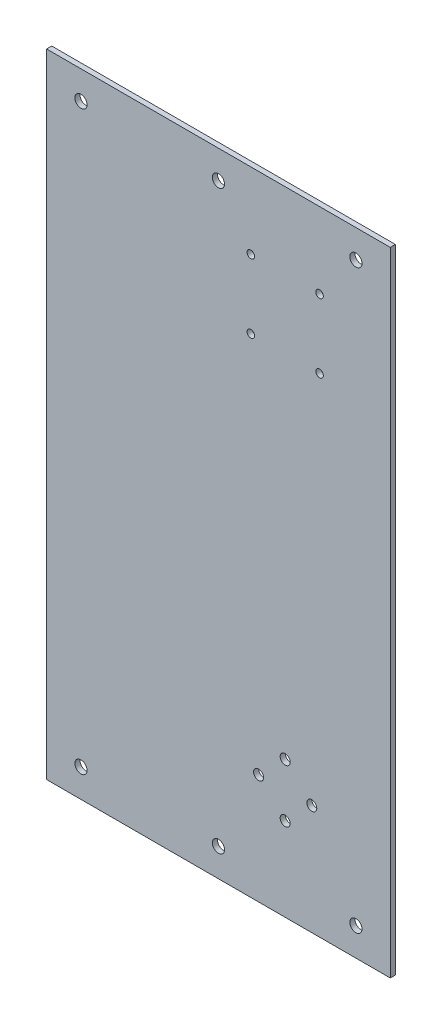
ISO-10303-21;
HEADER;
FILE_DESCRIPTION(('STEP AP214'),'2;1');
FILE_NAME('part.step','',(''),(''),'','','');
FILE_SCHEMA(('AUTOMOTIVE_DESIGN { 1 0 10303 214 1 1 1 1 }'));
ENDSEC;
DATA;
#1=APPLICATION_CONTEXT('core data for automotive mechanical design processes');
#2=APPLICATION_PROTOCOL_DEFINITION('international standard','automotive_design',2000,#1);
#3=PRODUCT_CONTEXT('',#1,'mechanical');
#4=PRODUCT('Part','Part','',(#3));
#5=PRODUCT_RELATED_PRODUCT_CATEGORY('part','',(#4));
#6=PRODUCT_DEFINITION_FORMATION('','',#4);
#7=PRODUCT_DEFINITION_CONTEXT('part definition',#1,'design');
#8=PRODUCT_DEFINITION('design','',#6,#7);
#9=PRODUCT_DEFINITION_SHAPE('','',#8);
#10=(LENGTH_UNIT() NAMED_UNIT(*) SI_UNIT(.MILLI.,.METRE.));
#11=(NAMED_UNIT(*) PLANE_ANGLE_UNIT() SI_UNIT($,.RADIAN.));
#12=(NAMED_UNIT(*) SI_UNIT($,.STERADIAN.) SOLID_ANGLE_UNIT());
#13=UNCERTAINTY_MEASURE_WITH_UNIT(LENGTH_MEASURE(1.E-05),#10,'distance_accuracy_value','');
#14=(GEOMETRIC_REPRESENTATION_CONTEXT(3) GLOBAL_UNCERTAINTY_ASSIGNED_CONTEXT((#13)) GLOBAL_UNIT_ASSIGNED_CONTEXT((#10,
#11,#12)) REPRESENTATION_CONTEXT('',''));
#15=CARTESIAN_POINT('',(0.,0.,0.));
#16=DIRECTION('',(0.,0.,1.));
#17=DIRECTION('',(1.,0.,0.));
#18=AXIS2_PLACEMENT_3D('',#15,#16,#17);
#19=CARTESIAN_POINT('',(77.5,142.695,2.305));
#20=DIRECTION('',(-1.,0.,0.));
#21=DIRECTION('',(0.,-1.,0.));
#22=AXIS2_PLACEMENT_3D('',#19,#20,#21);
#23=PLANE('',#22);
#24=DIRECTION('',(0.,1.,0.));
#25=VECTOR('',#24,1.);
#26=CARTESIAN_POINT('',(77.5,142.695,0.));
#27=LINE('',#26,#25);
#28=CARTESIAN_POINT('',(77.5,-142.695,0.));
#29=VERTEX_POINT('',#28);
#30=CARTESIAN_POINT('',(77.5,142.695,0.));
#31=VERTEX_POINT('',#30);
#32=EDGE_CURVE('E113',#29,#31,#27,.T.);
#33=ORIENTED_EDGE('',*,*,#32,.T.);
#34=DIRECTION('',(0.,0.,-1.));
#35=VECTOR('',#34,1.);
#36=CARTESIAN_POINT('',(77.5,142.695,2.305));
#37=LINE('',#36,#35);
#38=CARTESIAN_POINT('',(77.5,142.695,2.305));
#39=VERTEX_POINT('',#38);
#40=EDGE_CURVE('E11',#39,#31,#37,.T.);
#41=ORIENTED_EDGE('',*,*,#40,.F.);
#42=DIRECTION('',(0.,1.,0.));
#43=VECTOR('',#42,1.);
#44=CARTESIAN_POINT('',(77.5,142.695,2.305));
#45=LINE('',#44,#43);
#46=CARTESIAN_POINT('',(77.5,-142.695,2.305));
#47=VERTEX_POINT('',#46);
#48=EDGE_CURVE('E95',#47,#39,#45,.T.);
#49=ORIENTED_EDGE('',*,*,#48,.F.);
#50=DIRECTION('',(0.,0.,-1.));
#51=VECTOR('',#50,1.);
#52=CARTESIAN_POINT('',(77.5,-142.695,2.305));
#53=LINE('',#52,#51);
#54=EDGE_CURVE('E109',#47,#29,#53,.T.);
#55=ORIENTED_EDGE('',*,*,#54,.T.);
#56=EDGE_LOOP('',(#33,#41,#49,#55));
#57=FACE_BOUND('',#56,.T.);
#58=ADVANCED_FACE('F43',(#57),#23,.F.);
#59=CARTESIAN_POINT('',(-77.5,142.695,2.305));
#60=DIRECTION('',(0.,-1.,0.));
#61=DIRECTION('',(0.,0.,-1.));
#62=AXIS2_PLACEMENT_3D('',#59,#60,#61);
#63=PLANE('',#62);
#64=DIRECTION('',(-1.,0.,0.));
#65=VECTOR('',#64,1.);
#66=CARTESIAN_POINT('',(-77.5,142.695,0.));
#67=LINE('',#66,#65);
#68=CARTESIAN_POINT('',(-77.5,142.695,0.));
#69=VERTEX_POINT('',#68);
#70=EDGE_CURVE('E100',#31,#69,#67,.T.);
#71=ORIENTED_EDGE('',*,*,#70,.T.);
#72=DIRECTION('',(0.,0.,-1.));
#73=VECTOR('',#72,1.);
#74=CARTESIAN_POINT('',(-77.5,142.695,2.305));
#75=LINE('',#74,#73);
#76=CARTESIAN_POINT('',(-77.5,142.695,2.305));
#77=VERTEX_POINT('',#76);
#78=EDGE_CURVE('E52',#77,#69,#75,.T.);
#79=ORIENTED_EDGE('',*,*,#78,.F.);
#80=DIRECTION('',(-1.,0.,0.));
#81=VECTOR('',#80,1.);
#82=CARTESIAN_POINT('',(-77.5,142.695,2.305));
#83=LINE('',#82,#81);
#84=EDGE_CURVE('E90',#39,#77,#83,.T.);
#85=ORIENTED_EDGE('',*,*,#84,.F.);
#86=ORIENTED_EDGE('',*,*,#40,.T.);
#87=EDGE_LOOP('',(#71,#79,#85,#86));
#88=FACE_BOUND('',#87,.T.);
#89=ADVANCED_FACE('F99',(#88),#63,.F.);
#90=CARTESIAN_POINT('',(-77.5,142.695,2.305));
#91=DIRECTION('',(1.,0.,0.));
#92=DIRECTION('',(0.,1.,0.));
#93=AXIS2_PLACEMENT_3D('',#90,#91,#92);
#94=PLANE('',#93);
#95=DIRECTION('',(0.,-1.,0.));
#96=VECTOR('',#95,1.);
#97=CARTESIAN_POINT('',(-77.5,142.695,0.));
#98=LINE('',#97,#96);
#99=CARTESIAN_POINT('',(-77.5,-142.695,0.));
#100=VERTEX_POINT('',#99);
#101=EDGE_CURVE('E77',#69,#100,#98,.T.);
#102=ORIENTED_EDGE('',*,*,#101,.T.);
#103=DIRECTION('',(0.,0.,-1.));
#104=VECTOR('',#103,1.);
#105=CARTESIAN_POINT('',(-77.5,-142.695,2.305));
#106=LINE('',#105,#104);
#107=CARTESIAN_POINT('',(-77.5,-142.695,2.305));
#108=VERTEX_POINT('',#107);
#109=EDGE_CURVE('E102',#108,#100,#106,.T.);
#110=ORIENTED_EDGE('',*,*,#109,.F.);
#111=DIRECTION('',(0.,-1.,0.));
#112=VECTOR('',#111,1.);
#113=CARTESIAN_POINT('',(-77.5,142.695,2.305));
#114=LINE('',#113,#112);
#115=EDGE_CURVE('E93',#77,#108,#114,.T.);
#116=ORIENTED_EDGE('',*,*,#115,.F.);
#117=ORIENTED_EDGE('',*,*,#78,.T.);
#118=EDGE_LOOP('',(#102,#110,#116,#117));
#119=FACE_BOUND('',#118,.T.);
#120=ADVANCED_FACE('F103',(#119),#94,.F.);
#121=CARTESIAN_POINT('',(-77.5,-142.695,2.305));
#122=DIRECTION('',(0.,1.,0.));
#123=DIRECTION('',(0.,0.,1.));
#124=AXIS2_PLACEMENT_3D('',#121,#122,#123);
#125=PLANE('',#124);
#126=DIRECTION('',(1.,0.,0.));
#127=VECTOR('',#126,1.);
#128=CARTESIAN_POINT('',(-77.5,-142.695,0.));
#129=LINE('',#128,#127);
#130=EDGE_CURVE('E83',#100,#29,#129,.T.);
#131=ORIENTED_EDGE('',*,*,#130,.T.);
#132=ORIENTED_EDGE('',*,*,#54,.F.);
#133=DIRECTION('',(1.,0.,0.));
#134=VECTOR('',#133,1.);
#135=CARTESIAN_POINT('',(-77.5,-142.695,2.305));
#136=LINE('',#135,#134);
#137=EDGE_CURVE('E60',#108,#47,#136,.T.);
#138=ORIENTED_EDGE('',*,*,#137,.F.);
#139=ORIENTED_EDGE('',*,*,#109,.T.);
#140=EDGE_LOOP('',(#131,#132,#138,#139));
#141=FACE_BOUND('',#140,.T.);
#142=ADVANCED_FACE('F129',(#141),#125,.F.);
#143=CARTESIAN_POINT('',(0.,0.,2.305));
#144=DIRECTION('',(0.,0.,1.));
#145=DIRECTION('',(1.,0.,0.));
#146=AXIS2_PLACEMENT_3D('',#143,#144,#145);
#147=PLANE('',#146);
#148=CARTESIAN_POINT('',(62.,129.995,2.305));
#149=DIRECTION('',(0.,0.,1.));
#150=DIRECTION('',(1.,0.,0.));
#151=AXIS2_PLACEMENT_3D('',#148,#149,#150);
#152=CIRCLE('',#151,2.74999999999999);
#153=CARTESIAN_POINT('',(64.75,129.995,2.305));
#154=VERTEX_POINT('',#153);
#155=EDGE_CURVE('E245',#154,#154,#152,.T.);
#156=ORIENTED_EDGE('',*,*,#155,.F.);
#157=EDGE_LOOP('',(#156));
#158=FACE_BOUND('',#157,.T.);
#159=CARTESIAN_POINT('',(45.6,108.5,2.305));
#160=DIRECTION('',(0.,0.,1.));
#161=DIRECTION('',(1.,0.,0.));
#162=AXIS2_PLACEMENT_3D('',#159,#160,#161);
#163=CIRCLE('',#162,1.7);
#164=CARTESIAN_POINT('',(47.3,108.5,2.305));
#165=VERTEX_POINT('',#164);
#166=EDGE_CURVE('E202',#165,#165,#163,.T.);
#167=ORIENTED_EDGE('',*,*,#166,.F.);
#168=EDGE_LOOP('',(#167));
#169=FACE_BOUND('',#168,.T.);
#170=CARTESIAN_POINT('',(18.1,-92.9999999999999,2.305));
#171=DIRECTION('',(0.,0.,1.));
#172=DIRECTION('',(1.,0.,0.));
#173=AXIS2_PLACEMENT_3D('',#170,#171,#172);
#174=CIRCLE('',#173,2.25);
#175=CARTESIAN_POINT('',(20.35,-92.9999999999999,2.305));
#176=VERTEX_POINT('',#175);
#177=EDGE_CURVE('E211',#176,#176,#174,.T.);
#178=ORIENTED_EDGE('',*,*,#177,.F.);
#179=EDGE_LOOP('',(#178));
#180=FACE_BOUND('',#179,.T.);
#181=CARTESIAN_POINT('',(30.1,-105.,2.305));
#182=DIRECTION('',(0.,0.,1.));
#183=DIRECTION('',(1.,0.,0.));
#184=AXIS2_PLACEMENT_3D('',#181,#182,#183);
#185=CIRCLE('',#184,2.25);
#186=CARTESIAN_POINT('',(32.35,-105.,2.305));
#187=VERTEX_POINT('',#186);
#188=EDGE_CURVE('E186',#187,#187,#185,.T.);
#189=ORIENTED_EDGE('',*,*,#188,.F.);
#190=EDGE_LOOP('',(#189));
#191=FACE_BOUND('',#190,.T.);
#192=CARTESIAN_POINT('',(42.1,-92.9999999999999,2.305));
#193=DIRECTION('',(0.,0.,1.));
#194=DIRECTION('',(1.,0.,0.));
#195=AXIS2_PLACEMENT_3D('',#192,#193,#194);
#196=CIRCLE('',#195,2.25);
#197=CARTESIAN_POINT('',(44.35,-92.9999999999999,2.305));
#198=VERTEX_POINT('',#197);
#199=EDGE_CURVE('E195',#198,#198,#196,.T.);
#200=ORIENTED_EDGE('',*,*,#199,.F.);
#201=EDGE_LOOP('',(#200));
#202=FACE_BOUND('',#201,.T.);
#203=CARTESIAN_POINT('',(14.6,77.5,2.305));
#204=DIRECTION('',(0.,0.,1.));
#205=DIRECTION('',(1.,0.,0.));
#206=AXIS2_PLACEMENT_3D('',#203,#204,#205);
#207=CIRCLE('',#206,1.7);
#208=CARTESIAN_POINT('',(16.3,77.5,2.305));
#209=VERTEX_POINT('',#208);
#210=EDGE_CURVE('E235',#209,#209,#207,.T.);
#211=ORIENTED_EDGE('',*,*,#210,.F.);
#212=EDGE_LOOP('',(#211));
#213=FACE_BOUND('',#212,.T.);
#214=CARTESIAN_POINT('',(45.6,77.5,2.305));
#215=DIRECTION('',(0.,0.,1.));
#216=DIRECTION('',(1.,0.,0.));
#217=AXIS2_PLACEMENT_3D('',#214,#215,#216);
#218=CIRCLE('',#217,1.7);
#219=CARTESIAN_POINT('',(47.3,77.5,2.305));
#220=VERTEX_POINT('',#219);
#221=EDGE_CURVE('E227',#220,#220,#218,.T.);
#222=ORIENTED_EDGE('',*,*,#221,.F.);
#223=EDGE_LOOP('',(#222));
#224=FACE_BOUND('',#223,.T.);
#225=CARTESIAN_POINT('',(14.6,108.5,2.305));
#226=DIRECTION('',(0.,0.,1.));
#227=DIRECTION('',(1.,0.,0.));
#228=AXIS2_PLACEMENT_3D('',#225,#226,#227);
#229=CIRCLE('',#228,1.7);
#230=CARTESIAN_POINT('',(16.3,108.5,2.305));
#231=VERTEX_POINT('',#230);
#232=EDGE_CURVE('E218',#231,#231,#229,.T.);
#233=ORIENTED_EDGE('',*,*,#232,.F.);
#234=EDGE_LOOP('',(#233));
#235=FACE_BOUND('',#234,.T.);
#236=CARTESIAN_POINT('',(30.1,-80.9999999999999,2.305));
#237=DIRECTION('',(0.,0.,1.));
#238=DIRECTION('',(1.,0.,0.));
#239=AXIS2_PLACEMENT_3D('',#236,#237,#238);
#240=CIRCLE('',#239,2.25);
#241=CARTESIAN_POINT('',(32.35,-80.9999999999999,2.305));
#242=VERTEX_POINT('',#241);
#243=EDGE_CURVE('E178',#242,#242,#240,.T.);
#244=ORIENTED_EDGE('',*,*,#243,.F.);
#245=EDGE_LOOP('',(#244));
#246=FACE_BOUND('',#245,.T.);
#247=CARTESIAN_POINT('',(-62.,129.995,2.305));
#248=DIRECTION('',(0.,0.,1.));
#249=DIRECTION('',(1.,0.,0.));
#250=AXIS2_PLACEMENT_3D('',#247,#248,#249);
#251=CIRCLE('',#250,2.74999999999999);
#252=CARTESIAN_POINT('',(-59.25,129.995,2.305));
#253=VERTEX_POINT('',#252);
#254=EDGE_CURVE('E173',#253,#253,#251,.T.);
#255=ORIENTED_EDGE('',*,*,#254,.F.);
#256=EDGE_LOOP('',(#255));
#257=FACE_BOUND('',#256,.T.);
#258=CARTESIAN_POINT('',(0.,129.995,2.305));
#259=DIRECTION('',(0.,0.,1.));
#260=DIRECTION('',(1.,0.,0.));
#261=AXIS2_PLACEMENT_3D('',#258,#259,#260);
#262=CIRCLE('',#261,2.74999999999999);
#263=CARTESIAN_POINT('',(2.74999999999999,129.995,2.305));
#264=VERTEX_POINT('',#263);
#265=EDGE_CURVE('E165',#264,#264,#262,.T.);
#266=ORIENTED_EDGE('',*,*,#265,.F.);
#267=EDGE_LOOP('',(#266));
#268=FACE_BOUND('',#267,.T.);
#269=CARTESIAN_POINT('',(-62.,-129.995,2.305));
#270=DIRECTION('',(0.,0.,1.));
#271=DIRECTION('',(1.,0.,0.));
#272=AXIS2_PLACEMENT_3D('',#269,#270,#271);
#273=CIRCLE('',#272,2.74999999999999);
#274=CARTESIAN_POINT('',(-59.25,-129.995,2.305));
#275=VERTEX_POINT('',#274);
#276=EDGE_CURVE('E157',#275,#275,#273,.T.);
#277=ORIENTED_EDGE('',*,*,#276,.F.);
#278=EDGE_LOOP('',(#277));
#279=FACE_BOUND('',#278,.T.);
#280=CARTESIAN_POINT('',(0.,-129.995,2.305));
#281=DIRECTION('',(0.,0.,1.));
#282=DIRECTION('',(1.,0.,0.));
#283=AXIS2_PLACEMENT_3D('',#280,#281,#282);
#284=CIRCLE('',#283,2.74999999999999);
#285=CARTESIAN_POINT('',(2.74999999999999,-129.995,2.305));
#286=VERTEX_POINT('',#285);
#287=EDGE_CURVE('E149',#286,#286,#284,.T.);
#288=ORIENTED_EDGE('',*,*,#287,.F.);
#289=EDGE_LOOP('',(#288));
#290=FACE_BOUND('',#289,.T.);
#291=CARTESIAN_POINT('',(62.,-129.995,2.305));
#292=DIRECTION('',(0.,0.,1.));
#293=DIRECTION('',(1.,0.,0.));
#294=AXIS2_PLACEMENT_3D('',#291,#292,#293);
#295=CIRCLE('',#294,2.74999999999999);
#296=CARTESIAN_POINT('',(64.75,-129.995,2.305));
#297=VERTEX_POINT('',#296);
#298=EDGE_CURVE('E141',#297,#297,#295,.T.);
#299=ORIENTED_EDGE('',*,*,#298,.F.);
#300=EDGE_LOOP('',(#299));
#301=FACE_BOUND('',#300,.T.);
#302=ORIENTED_EDGE('',*,*,#48,.T.);
#303=ORIENTED_EDGE('',*,*,#84,.T.);
#304=ORIENTED_EDGE('',*,*,#115,.T.);
#305=ORIENTED_EDGE('',*,*,#137,.T.);
#306=EDGE_LOOP('',(#302,#303,#304,#305));
#307=FACE_BOUND('',#306,.T.);
#308=ADVANCED_FACE('F91',(#158,#169,#180,#191,#202,#213,#224,#235,#246,#257,#268,#279,#290,#301,
#307),#147,.T.);
#309=CARTESIAN_POINT('',(0.,0.,0.));
#310=DIRECTION('',(0.,0.,1.));
#311=DIRECTION('',(1.,0.,0.));
#312=AXIS2_PLACEMENT_3D('',#309,#310,#311);
#313=PLANE('',#312);
#314=CARTESIAN_POINT('',(62.,129.995,0.));
#315=DIRECTION('',(0.,0.,1.));
#316=DIRECTION('',(1.,0.,0.));
#317=AXIS2_PLACEMENT_3D('',#314,#315,#316);
#318=CIRCLE('',#317,2.75);
#319=CARTESIAN_POINT('',(64.75,129.995,0.));
#320=VERTEX_POINT('',#319);
#321=EDGE_CURVE('E223',#320,#320,#318,.T.);
#322=ORIENTED_EDGE('',*,*,#321,.T.);
#323=EDGE_LOOP('',(#322));
#324=FACE_BOUND('',#323,.T.);
#325=CARTESIAN_POINT('',(45.6,108.5,0.));
#326=DIRECTION('',(0.,0.,1.));
#327=DIRECTION('',(1.,0.,0.));
#328=AXIS2_PLACEMENT_3D('',#325,#326,#327);
#329=CIRCLE('',#328,1.7);
#330=CARTESIAN_POINT('',(47.3,108.5,0.));
#331=VERTEX_POINT('',#330);
#332=EDGE_CURVE('E206',#331,#331,#329,.T.);
#333=ORIENTED_EDGE('',*,*,#332,.T.);
#334=EDGE_LOOP('',(#333));
#335=FACE_BOUND('',#334,.T.);
#336=CARTESIAN_POINT('',(18.1,-92.9999999999999,0.));
#337=DIRECTION('',(0.,0.,1.));
#338=DIRECTION('',(1.,0.,0.));
#339=AXIS2_PLACEMENT_3D('',#336,#337,#338);
#340=CIRCLE('',#339,2.25);
#341=CARTESIAN_POINT('',(20.35,-92.9999999999999,0.));
#342=VERTEX_POINT('',#341);
#343=EDGE_CURVE('E191',#342,#342,#340,.T.);
#344=ORIENTED_EDGE('',*,*,#343,.T.);
#345=EDGE_LOOP('',(#344));
#346=FACE_BOUND('',#345,.T.);
#347=CARTESIAN_POINT('',(30.1,-105.,0.));
#348=DIRECTION('',(0.,0.,1.));
#349=DIRECTION('',(1.,0.,0.));
#350=AXIS2_PLACEMENT_3D('',#347,#348,#349);
#351=CIRCLE('',#350,2.25);
#352=CARTESIAN_POINT('',(32.35,-105.,0.));
#353=VERTEX_POINT('',#352);
#354=EDGE_CURVE('E190',#353,#353,#351,.T.);
#355=ORIENTED_EDGE('',*,*,#354,.T.);
#356=EDGE_LOOP('',(#355));
#357=FACE_BOUND('',#356,.T.);
#358=CARTESIAN_POINT('',(42.1,-92.9999999999999,0.));
#359=DIRECTION('',(0.,0.,1.));
#360=DIRECTION('',(1.,0.,0.));
#361=AXIS2_PLACEMENT_3D('',#358,#359,#360);
#362=CIRCLE('',#361,2.25);
#363=CARTESIAN_POINT('',(44.35,-92.9999999999999,0.));
#364=VERTEX_POINT('',#363);
#365=EDGE_CURVE('E182',#364,#364,#362,.T.);
#366=ORIENTED_EDGE('',*,*,#365,.T.);
#367=EDGE_LOOP('',(#366));
#368=FACE_BOUND('',#367,.T.);
#369=CARTESIAN_POINT('',(14.6,77.5,0.));
#370=DIRECTION('',(0.,0.,1.));
#371=DIRECTION('',(1.,0.,0.));
#372=AXIS2_PLACEMENT_3D('',#369,#370,#371);
#373=CIRCLE('',#372,1.7);
#374=CARTESIAN_POINT('',(16.3,77.5,0.));
#375=VERTEX_POINT('',#374);
#376=EDGE_CURVE('E207',#375,#375,#373,.T.);
#377=ORIENTED_EDGE('',*,*,#376,.T.);
#378=EDGE_LOOP('',(#377));
#379=FACE_BOUND('',#378,.T.);
#380=CARTESIAN_POINT('',(45.6,77.5,0.));
#381=DIRECTION('',(0.,0.,1.));
#382=DIRECTION('',(1.,0.,0.));
#383=AXIS2_PLACEMENT_3D('',#380,#381,#382);
#384=CIRCLE('',#383,1.7);
#385=CARTESIAN_POINT('',(47.3,77.5,0.));
#386=VERTEX_POINT('',#385);
#387=EDGE_CURVE('E231',#386,#386,#384,.T.);
#388=ORIENTED_EDGE('',*,*,#387,.T.);
#389=EDGE_LOOP('',(#388));
#390=FACE_BOUND('',#389,.T.);
#391=CARTESIAN_POINT('',(14.6,108.5,0.));
#392=DIRECTION('',(0.,0.,1.));
#393=DIRECTION('',(1.,0.,0.));
#394=AXIS2_PLACEMENT_3D('',#391,#392,#393);
#395=CIRCLE('',#394,1.7);
#396=CARTESIAN_POINT('',(16.3,108.5,0.));
#397=VERTEX_POINT('',#396);
#398=EDGE_CURVE('E222',#397,#397,#395,.T.);
#399=ORIENTED_EDGE('',*,*,#398,.T.);
#400=EDGE_LOOP('',(#399));
#401=FACE_BOUND('',#400,.T.);
#402=CARTESIAN_POINT('',(30.1,-80.9999999999999,0.));
#403=DIRECTION('',(0.,0.,1.));
#404=DIRECTION('',(1.,0.,0.));
#405=AXIS2_PLACEMENT_3D('',#402,#403,#404);
#406=CIRCLE('',#405,2.25);
#407=CARTESIAN_POINT('',(32.35,-80.9999999999999,0.));
#408=VERTEX_POINT('',#407);
#409=EDGE_CURVE('E177',#408,#408,#406,.T.);
#410=ORIENTED_EDGE('',*,*,#409,.T.);
#411=EDGE_LOOP('',(#410));
#412=FACE_BOUND('',#411,.T.);
#413=CARTESIAN_POINT('',(-62.,129.995,0.));
#414=DIRECTION('',(0.,0.,1.));
#415=DIRECTION('',(1.,0.,0.));
#416=AXIS2_PLACEMENT_3D('',#413,#414,#415);
#417=CIRCLE('',#416,2.75);
#418=CARTESIAN_POINT('',(-59.25,129.995,0.));
#419=VERTEX_POINT('',#418);
#420=EDGE_CURVE('E169',#419,#419,#417,.T.);
#421=ORIENTED_EDGE('',*,*,#420,.T.);
#422=EDGE_LOOP('',(#421));
#423=FACE_BOUND('',#422,.T.);
#424=CARTESIAN_POINT('',(0.,129.995,0.));
#425=DIRECTION('',(0.,0.,1.));
#426=DIRECTION('',(1.,0.,0.));
#427=AXIS2_PLACEMENT_3D('',#424,#425,#426);
#428=CIRCLE('',#427,2.75);
#429=CARTESIAN_POINT('',(2.75,129.995,0.));
#430=VERTEX_POINT('',#429);
#431=EDGE_CURVE('E161',#430,#430,#428,.T.);
#432=ORIENTED_EDGE('',*,*,#431,.T.);
#433=EDGE_LOOP('',(#432));
#434=FACE_BOUND('',#433,.T.);
#435=CARTESIAN_POINT('',(-62.,-129.995,0.));
#436=DIRECTION('',(0.,0.,1.));
#437=DIRECTION('',(1.,0.,0.));
#438=AXIS2_PLACEMENT_3D('',#435,#436,#437);
#439=CIRCLE('',#438,2.75);
#440=CARTESIAN_POINT('',(-59.25,-129.995,0.));
#441=VERTEX_POINT('',#440);
#442=EDGE_CURVE('E153',#441,#441,#439,.T.);
#443=ORIENTED_EDGE('',*,*,#442,.T.);
#444=EDGE_LOOP('',(#443));
#445=FACE_BOUND('',#444,.T.);
#446=CARTESIAN_POINT('',(0.,-129.995,0.));
#447=DIRECTION('',(0.,0.,1.));
#448=DIRECTION('',(1.,0.,0.));
#449=AXIS2_PLACEMENT_3D('',#446,#447,#448);
#450=CIRCLE('',#449,2.75);
#451=CARTESIAN_POINT('',(2.75,-129.995,0.));
#452=VERTEX_POINT('',#451);
#453=EDGE_CURVE('E145',#452,#452,#450,.T.);
#454=ORIENTED_EDGE('',*,*,#453,.T.);
#455=EDGE_LOOP('',(#454));
#456=FACE_BOUND('',#455,.T.);
#457=CARTESIAN_POINT('',(62.,-129.995,0.));
#458=DIRECTION('',(0.,0.,1.));
#459=DIRECTION('',(1.,0.,0.));
#460=AXIS2_PLACEMENT_3D('',#457,#458,#459);
#461=CIRCLE('',#460,2.75);
#462=CARTESIAN_POINT('',(64.75,-129.995,0.));
#463=VERTEX_POINT('',#462);
#464=EDGE_CURVE('E117',#463,#463,#461,.T.);
#465=ORIENTED_EDGE('',*,*,#464,.T.);
#466=EDGE_LOOP('',(#465));
#467=FACE_BOUND('',#466,.T.);
#468=ORIENTED_EDGE('',*,*,#32,.F.);
#469=ORIENTED_EDGE('',*,*,#130,.F.);
#470=ORIENTED_EDGE('',*,*,#101,.F.);
#471=ORIENTED_EDGE('',*,*,#70,.F.);
#472=EDGE_LOOP('',(#468,#469,#470,#471));
#473=FACE_BOUND('',#472,.T.);
#474=ADVANCED_FACE('F132',(#324,#335,#346,#357,#368,#379,#390,#401,#412,#423,#434,#445,#456,
#467,#473),#313,.F.);
#475=CARTESIAN_POINT('',(62.,-129.995,2.305));
#476=DIRECTION('',(0.,0.,1.));
#477=DIRECTION('',(1.,0.,0.));
#478=AXIS2_PLACEMENT_3D('',#475,#476,#477);
#479=CYLINDRICAL_SURFACE('',#478,2.75);
#480=ORIENTED_EDGE('',*,*,#464,.F.);
#481=EDGE_LOOP('',(#480));
#482=FACE_BOUND('',#481,.T.);
#483=ORIENTED_EDGE('',*,*,#298,.T.);
#484=EDGE_LOOP('',(#483));
#485=FACE_BOUND('',#484,.T.);
#486=ADVANCED_FACE('F283',(#482,#485),#479,.F.);
#487=CARTESIAN_POINT('',(0.,-129.995,2.305));
#488=DIRECTION('',(0.,0.,1.));
#489=DIRECTION('',(1.,0.,0.));
#490=AXIS2_PLACEMENT_3D('',#487,#488,#489);
#491=CYLINDRICAL_SURFACE('',#490,2.74999999999999);
#492=ORIENTED_EDGE('',*,*,#453,.F.);
#493=EDGE_LOOP('',(#492));
#494=FACE_BOUND('',#493,.T.);
#495=ORIENTED_EDGE('',*,*,#287,.T.);
#496=EDGE_LOOP('',(#495));
#497=FACE_BOUND('',#496,.T.);
#498=ADVANCED_FACE('F285',(#494,#497),#491,.F.);
#499=CARTESIAN_POINT('',(-62.,-129.995,2.305));
#500=DIRECTION('',(0.,0.,1.));
#501=DIRECTION('',(1.,0.,0.));
#502=AXIS2_PLACEMENT_3D('',#499,#500,#501);
#503=CYLINDRICAL_SURFACE('',#502,2.75);
#504=ORIENTED_EDGE('',*,*,#442,.F.);
#505=EDGE_LOOP('',(#504));
#506=FACE_BOUND('',#505,.T.);
#507=ORIENTED_EDGE('',*,*,#276,.T.);
#508=EDGE_LOOP('',(#507));
#509=FACE_BOUND('',#508,.T.);
#510=ADVANCED_FACE('F292',(#506,#509),#503,.F.);
#511=CARTESIAN_POINT('',(0.,129.995,2.305));
#512=DIRECTION('',(0.,0.,1.));
#513=DIRECTION('',(1.,0.,0.));
#514=AXIS2_PLACEMENT_3D('',#511,#512,#513);
#515=CYLINDRICAL_SURFACE('',#514,2.74999999999999);
#516=ORIENTED_EDGE('',*,*,#431,.F.);
#517=EDGE_LOOP('',(#516));
#518=FACE_BOUND('',#517,.T.);
#519=ORIENTED_EDGE('',*,*,#265,.T.);
#520=EDGE_LOOP('',(#519));
#521=FACE_BOUND('',#520,.T.);
#522=ADVANCED_FACE('F340',(#518,#521),#515,.F.);
#523=CARTESIAN_POINT('',(-62.,129.995,2.305));
#524=DIRECTION('',(0.,0.,1.));
#525=DIRECTION('',(1.,0.,0.));
#526=AXIS2_PLACEMENT_3D('',#523,#524,#525);
#527=CYLINDRICAL_SURFACE('',#526,2.75);
#528=ORIENTED_EDGE('',*,*,#420,.F.);
#529=EDGE_LOOP('',(#528));
#530=FACE_BOUND('',#529,.T.);
#531=ORIENTED_EDGE('',*,*,#254,.T.);
#532=EDGE_LOOP('',(#531));
#533=FACE_BOUND('',#532,.T.);
#534=ADVANCED_FACE('F350',(#530,#533),#527,.F.);
#535=CARTESIAN_POINT('',(30.1,-80.9999999999999,0.));
#536=DIRECTION('',(0.,0.,1.));
#537=DIRECTION('',(1.,0.,0.));
#538=AXIS2_PLACEMENT_3D('',#535,#536,#537);
#539=CYLINDRICAL_SURFACE('',#538,2.25);
#540=ORIENTED_EDGE('',*,*,#409,.F.);
#541=EDGE_LOOP('',(#540));
#542=FACE_BOUND('',#541,.T.);
#543=ORIENTED_EDGE('',*,*,#243,.T.);
#544=EDGE_LOOP('',(#543));
#545=FACE_BOUND('',#544,.T.);
#546=ADVANCED_FACE('F360',(#542,#545),#539,.F.);
#547=CARTESIAN_POINT('',(14.6,108.5,0.));
#548=DIRECTION('',(0.,0.,1.));
#549=DIRECTION('',(1.,0.,0.));
#550=AXIS2_PLACEMENT_3D('',#547,#548,#549);
#551=CYLINDRICAL_SURFACE('',#550,1.7);
#552=ORIENTED_EDGE('',*,*,#398,.F.);
#553=EDGE_LOOP('',(#552));
#554=FACE_BOUND('',#553,.T.);
#555=ORIENTED_EDGE('',*,*,#232,.T.);
#556=EDGE_LOOP('',(#555));
#557=FACE_BOUND('',#556,.T.);
#558=ADVANCED_FACE('F370',(#554,#557),#551,.F.);
#559=CARTESIAN_POINT('',(45.6,77.5,0.));
#560=DIRECTION('',(0.,0.,1.));
#561=DIRECTION('',(1.,0.,0.));
#562=AXIS2_PLACEMENT_3D('',#559,#560,#561);
#563=CYLINDRICAL_SURFACE('',#562,1.7);
#564=ORIENTED_EDGE('',*,*,#387,.F.);
#565=EDGE_LOOP('',(#564));
#566=FACE_BOUND('',#565,.T.);
#567=ORIENTED_EDGE('',*,*,#221,.T.);
#568=EDGE_LOOP('',(#567));
#569=FACE_BOUND('',#568,.T.);
#570=ADVANCED_FACE('F380',(#566,#569),#563,.F.);
#571=CARTESIAN_POINT('',(14.6,77.5,0.));
#572=DIRECTION('',(0.,0.,1.));
#573=DIRECTION('',(1.,0.,0.));
#574=AXIS2_PLACEMENT_3D('',#571,#572,#573);
#575=CYLINDRICAL_SURFACE('',#574,1.7);
#576=ORIENTED_EDGE('',*,*,#376,.F.);
#577=EDGE_LOOP('',(#576));
#578=FACE_BOUND('',#577,.T.);
#579=ORIENTED_EDGE('',*,*,#210,.T.);
#580=EDGE_LOOP('',(#579));
#581=FACE_BOUND('',#580,.T.);
#582=ADVANCED_FACE('F390',(#578,#581),#575,.F.);
#583=CARTESIAN_POINT('',(42.1,-92.9999999999999,0.));
#584=DIRECTION('',(0.,0.,1.));
#585=DIRECTION('',(1.,0.,0.));
#586=AXIS2_PLACEMENT_3D('',#583,#584,#585);
#587=CYLINDRICAL_SURFACE('',#586,2.25);
#588=ORIENTED_EDGE('',*,*,#365,.F.);
#589=EDGE_LOOP('',(#588));
#590=FACE_BOUND('',#589,.T.);
#591=ORIENTED_EDGE('',*,*,#199,.T.);
#592=EDGE_LOOP('',(#591));
#593=FACE_BOUND('',#592,.T.);
#594=ADVANCED_FACE('F400',(#590,#593),#587,.F.);
#595=CARTESIAN_POINT('',(30.1,-105.,0.));
#596=DIRECTION('',(0.,0.,1.));
#597=DIRECTION('',(1.,0.,0.));
#598=AXIS2_PLACEMENT_3D('',#595,#596,#597);
#599=CYLINDRICAL_SURFACE('',#598,2.25);
#600=ORIENTED_EDGE('',*,*,#354,.F.);
#601=EDGE_LOOP('',(#600));
#602=FACE_BOUND('',#601,.T.);
#603=ORIENTED_EDGE('',*,*,#188,.T.);
#604=EDGE_LOOP('',(#603));
#605=FACE_BOUND('',#604,.T.);
#606=ADVANCED_FACE('F410',(#602,#605),#599,.F.);
#607=CARTESIAN_POINT('',(18.1,-92.9999999999999,0.));
#608=DIRECTION('',(0.,0.,1.));
#609=DIRECTION('',(1.,0.,0.));
#610=AXIS2_PLACEMENT_3D('',#607,#608,#609);
#611=CYLINDRICAL_SURFACE('',#610,2.25);
#612=ORIENTED_EDGE('',*,*,#343,.F.);
#613=EDGE_LOOP('',(#612));
#614=FACE_BOUND('',#613,.T.);
#615=ORIENTED_EDGE('',*,*,#177,.T.);
#616=EDGE_LOOP('',(#615));
#617=FACE_BOUND('',#616,.T.);
#618=ADVANCED_FACE('F420',(#614,#617),#611,.F.);
#619=CARTESIAN_POINT('',(45.6,108.5,0.));
#620=DIRECTION('',(0.,0.,1.));
#621=DIRECTION('',(1.,0.,0.));
#622=AXIS2_PLACEMENT_3D('',#619,#620,#621);
#623=CYLINDRICAL_SURFACE('',#622,1.7);
#624=ORIENTED_EDGE('',*,*,#332,.F.);
#625=EDGE_LOOP('',(#624));
#626=FACE_BOUND('',#625,.T.);
#627=ORIENTED_EDGE('',*,*,#166,.T.);
#628=EDGE_LOOP('',(#627));
#629=FACE_BOUND('',#628,.T.);
#630=ADVANCED_FACE('F430',(#626,#629),#623,.F.);
#631=CARTESIAN_POINT('',(62.,129.995,2.305));
#632=DIRECTION('',(0.,0.,1.));
#633=DIRECTION('',(1.,0.,0.));
#634=AXIS2_PLACEMENT_3D('',#631,#632,#633);
#635=CYLINDRICAL_SURFACE('',#634,2.75);
#636=ORIENTED_EDGE('',*,*,#321,.F.);
#637=EDGE_LOOP('',(#636));
#638=FACE_BOUND('',#637,.T.);
#639=ORIENTED_EDGE('',*,*,#155,.T.);
#640=EDGE_LOOP('',(#639));
#641=FACE_BOUND('',#640,.T.);
#642=ADVANCED_FACE('F252',(#638,#641),#635,.F.);
#643=CLOSED_SHELL('',(#58,#89,#120,#142,#308,#474,#486,#498,#510,#522,#534,#546,#558,#570,#582,
#594,#606,#618,#630,#642));
#644=MANIFOLD_SOLID_BREP('B2',#643);
#645=ADVANCED_BREP_SHAPE_REPRESENTATION('',(#18,#644),#14);
#646=SHAPE_DEFINITION_REPRESENTATION(#9,#645);
ENDSEC;
END-ISO-10303-21;
